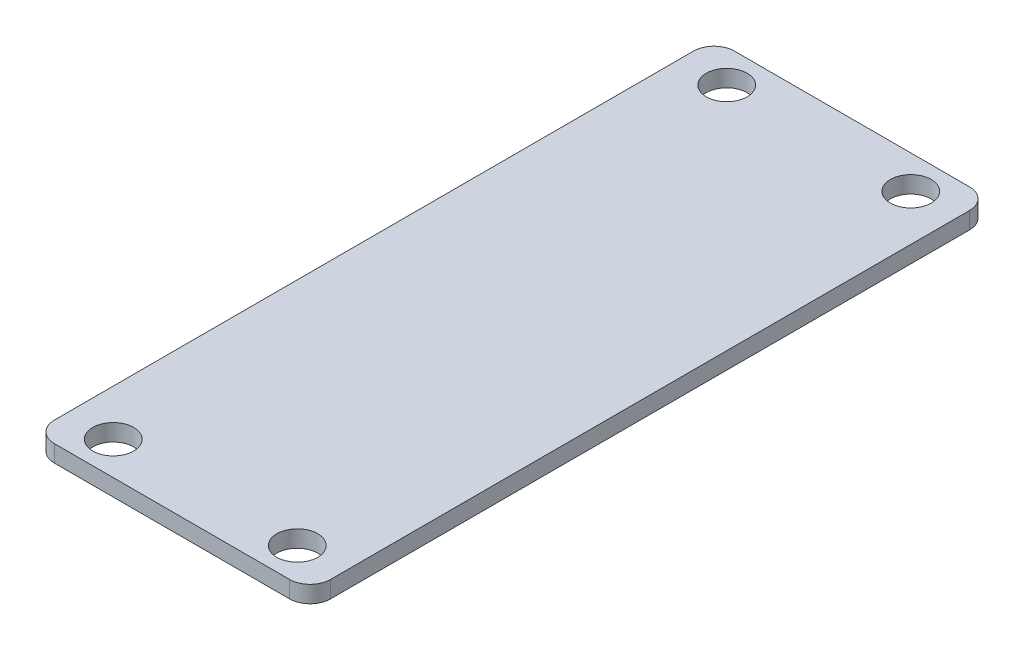
ISO-10303-21;
HEADER;
FILE_DESCRIPTION(('STEP AP214'),'2;1');
FILE_NAME('part.step','',(''),(''),'','','');
FILE_SCHEMA(('AUTOMOTIVE_DESIGN { 1 0 10303 214 1 1 1 1 }'));
ENDSEC;
DATA;
#1=APPLICATION_CONTEXT('core data for automotive mechanical design processes');
#2=APPLICATION_PROTOCOL_DEFINITION('international standard','automotive_design',2000,#1);
#3=PRODUCT_CONTEXT('',#1,'mechanical');
#4=PRODUCT('Part','Part','',(#3));
#5=PRODUCT_RELATED_PRODUCT_CATEGORY('part','',(#4));
#6=PRODUCT_DEFINITION_FORMATION('','',#4);
#7=PRODUCT_DEFINITION_CONTEXT('part definition',#1,'design');
#8=PRODUCT_DEFINITION('design','',#6,#7);
#9=PRODUCT_DEFINITION_SHAPE('','',#8);
#10=(LENGTH_UNIT() NAMED_UNIT(*) SI_UNIT(.MILLI.,.METRE.));
#11=(NAMED_UNIT(*) PLANE_ANGLE_UNIT() SI_UNIT($,.RADIAN.));
#12=(NAMED_UNIT(*) SI_UNIT($,.STERADIAN.) SOLID_ANGLE_UNIT());
#13=UNCERTAINTY_MEASURE_WITH_UNIT(LENGTH_MEASURE(1.E-05),#10,'distance_accuracy_value','');
#14=(GEOMETRIC_REPRESENTATION_CONTEXT(3) GLOBAL_UNCERTAINTY_ASSIGNED_CONTEXT((#13)) GLOBAL_UNIT_ASSIGNED_CONTEXT((#10,
#11,#12)) REPRESENTATION_CONTEXT('',''));
#15=CARTESIAN_POINT('',(0.,0.,0.));
#16=DIRECTION('',(0.,0.,1.));
#17=DIRECTION('',(1.,0.,0.));
#18=AXIS2_PLACEMENT_3D('',#15,#16,#17);
#19=CARTESIAN_POINT('',(-13.5,1.65,33.25));
#20=DIRECTION('',(1.,0.,0.));
#21=DIRECTION('',(0.,0.,-1.));
#22=AXIS2_PLACEMENT_3D('',#19,#20,#21);
#23=PLANE('',#22);
#24=DIRECTION('',(0.,0.,1.));
#25=VECTOR('',#24,1.);
#26=CARTESIAN_POINT('',(-13.5,1.65,33.25));
#27=LINE('',#26,#25);
#28=CARTESIAN_POINT('',(-13.5,1.65,-31.25));
#29=VERTEX_POINT('',#28);
#30=CARTESIAN_POINT('',(-13.5,1.65,31.25));
#31=VERTEX_POINT('',#30);
#32=EDGE_CURVE('E125',#29,#31,#27,.T.);
#33=ORIENTED_EDGE('',*,*,#32,.F.);
#34=DIRECTION('',(0.,-1.,0.));
#35=VECTOR('',#34,1.);
#36=CARTESIAN_POINT('',(-13.5,1.65,-31.25));
#37=LINE('',#36,#35);
#38=CARTESIAN_POINT('',(-13.5,0.,-31.25));
#39=VERTEX_POINT('',#38);
#40=EDGE_CURVE('E151',#29,#39,#37,.T.);
#41=ORIENTED_EDGE('',*,*,#40,.T.);
#42=DIRECTION('',(0.,0.,1.));
#43=VECTOR('',#42,1.);
#44=CARTESIAN_POINT('',(-13.5,0.,33.25));
#45=LINE('',#44,#43);
#46=CARTESIAN_POINT('',(-13.5,0.,31.25));
#47=VERTEX_POINT('',#46);
#48=EDGE_CURVE('E157',#39,#47,#45,.T.);
#49=ORIENTED_EDGE('',*,*,#48,.T.);
#50=DIRECTION('',(0.,-1.,0.));
#51=VECTOR('',#50,1.);
#52=CARTESIAN_POINT('',(-13.5,1.65,31.25));
#53=LINE('',#52,#51);
#54=EDGE_CURVE('E149',#47,#31,#53,.F.);
#55=ORIENTED_EDGE('',*,*,#54,.T.);
#56=EDGE_LOOP('',(#33,#41,#49,#55));
#57=FACE_BOUND('',#56,.T.);
#58=ADVANCED_FACE('F33',(#57),#23,.F.);
#59=CARTESIAN_POINT('',(13.5,1.65,33.25));
#60=DIRECTION('',(0.,0.,-1.));
#61=DIRECTION('',(-1.,0.,0.));
#62=AXIS2_PLACEMENT_3D('',#59,#60,#61);
#63=PLANE('',#62);
#64=DIRECTION('',(1.,0.,0.));
#65=VECTOR('',#64,1.);
#66=CARTESIAN_POINT('',(13.5,1.65,33.25));
#67=LINE('',#66,#65);
#68=CARTESIAN_POINT('',(-11.5,1.65,33.25));
#69=VERTEX_POINT('',#68);
#70=CARTESIAN_POINT('',(11.5,1.65,33.25));
#71=VERTEX_POINT('',#70);
#72=EDGE_CURVE('E128',#69,#71,#67,.T.);
#73=ORIENTED_EDGE('',*,*,#72,.F.);
#74=DIRECTION('',(0.,-1.,0.));
#75=VECTOR('',#74,1.);
#76=CARTESIAN_POINT('',(-11.5,1.65,33.25));
#77=LINE('',#76,#75);
#78=CARTESIAN_POINT('',(-11.5,0.,33.25));
#79=VERTEX_POINT('',#78);
#80=EDGE_CURVE('E11',#69,#79,#77,.T.);
#81=ORIENTED_EDGE('',*,*,#80,.T.);
#82=DIRECTION('',(1.,0.,0.));
#83=VECTOR('',#82,1.);
#84=CARTESIAN_POINT('',(13.5,0.,33.25));
#85=LINE('',#84,#83);
#86=CARTESIAN_POINT('',(11.5,0.,33.25));
#87=VERTEX_POINT('',#86);
#88=EDGE_CURVE('E130',#79,#87,#85,.T.);
#89=ORIENTED_EDGE('',*,*,#88,.T.);
#90=DIRECTION('',(0.,-1.,0.));
#91=VECTOR('',#90,1.);
#92=CARTESIAN_POINT('',(11.5,1.65,33.25));
#93=LINE('',#92,#91);
#94=EDGE_CURVE('E41',#87,#71,#93,.F.);
#95=ORIENTED_EDGE('',*,*,#94,.T.);
#96=EDGE_LOOP('',(#73,#81,#89,#95));
#97=FACE_BOUND('',#96,.T.);
#98=ADVANCED_FACE('F216',(#97),#63,.F.);
#99=CARTESIAN_POINT('',(13.5,1.65,33.25));
#100=DIRECTION('',(-1.,0.,0.));
#101=DIRECTION('',(0.,0.,1.));
#102=AXIS2_PLACEMENT_3D('',#99,#100,#101);
#103=PLANE('',#102);
#104=DIRECTION('',(0.,0.,-1.));
#105=VECTOR('',#104,1.);
#106=CARTESIAN_POINT('',(13.5,0.,33.25));
#107=LINE('',#106,#105);
#108=CARTESIAN_POINT('',(13.5,0.,31.25));
#109=VERTEX_POINT('',#108);
#110=CARTESIAN_POINT('',(13.5,0.,-31.25));
#111=VERTEX_POINT('',#110);
#112=EDGE_CURVE('E126',#109,#111,#107,.T.);
#113=ORIENTED_EDGE('',*,*,#112,.T.);
#114=DIRECTION('',(0.,-1.,0.));
#115=VECTOR('',#114,1.);
#116=CARTESIAN_POINT('',(13.5,1.65,-31.25));
#117=LINE('',#116,#115);
#118=CARTESIAN_POINT('',(13.5,1.65,-31.25));
#119=VERTEX_POINT('',#118);
#120=EDGE_CURVE('E104',#111,#119,#117,.F.);
#121=ORIENTED_EDGE('',*,*,#120,.T.);
#122=DIRECTION('',(0.,0.,-1.));
#123=VECTOR('',#122,1.);
#124=CARTESIAN_POINT('',(13.5,1.65,33.25));
#125=LINE('',#124,#123);
#126=CARTESIAN_POINT('',(13.5,1.65,31.25));
#127=VERTEX_POINT('',#126);
#128=EDGE_CURVE('E169',#127,#119,#125,.T.);
#129=ORIENTED_EDGE('',*,*,#128,.F.);
#130=DIRECTION('',(0.,-1.,0.));
#131=VECTOR('',#130,1.);
#132=CARTESIAN_POINT('',(13.5,1.65,31.25));
#133=LINE('',#132,#131);
#134=EDGE_CURVE('E109',#127,#109,#133,.T.);
#135=ORIENTED_EDGE('',*,*,#134,.T.);
#136=EDGE_LOOP('',(#113,#121,#129,#135));
#137=FACE_BOUND('',#136,.T.);
#138=ADVANCED_FACE('F214',(#137),#103,.F.);
#139=CARTESIAN_POINT('',(13.5,1.65,-33.25));
#140=DIRECTION('',(0.,0.,1.));
#141=DIRECTION('',(1.,0.,0.));
#142=AXIS2_PLACEMENT_3D('',#139,#140,#141);
#143=PLANE('',#142);
#144=DIRECTION('',(-1.,0.,0.));
#145=VECTOR('',#144,1.);
#146=CARTESIAN_POINT('',(13.5,1.65,-33.25));
#147=LINE('',#146,#145);
#148=CARTESIAN_POINT('',(11.5,1.65,-33.25));
#149=VERTEX_POINT('',#148);
#150=CARTESIAN_POINT('',(-11.5,1.65,-33.25));
#151=VERTEX_POINT('',#150);
#152=EDGE_CURVE('E119',#149,#151,#147,.T.);
#153=ORIENTED_EDGE('',*,*,#152,.F.);
#154=DIRECTION('',(0.,-1.,0.));
#155=VECTOR('',#154,1.);
#156=CARTESIAN_POINT('',(11.5,1.65,-33.25));
#157=LINE('',#156,#155);
#158=CARTESIAN_POINT('',(11.5,0.,-33.25));
#159=VERTEX_POINT('',#158);
#160=EDGE_CURVE('E103',#149,#159,#157,.T.);
#161=ORIENTED_EDGE('',*,*,#160,.T.);
#162=DIRECTION('',(-1.,0.,0.));
#163=VECTOR('',#162,1.);
#164=CARTESIAN_POINT('',(13.5,0.,-33.25));
#165=LINE('',#164,#163);
#166=CARTESIAN_POINT('',(-11.5,0.,-33.25));
#167=VERTEX_POINT('',#166);
#168=EDGE_CURVE('E116',#159,#167,#165,.T.);
#169=ORIENTED_EDGE('',*,*,#168,.T.);
#170=DIRECTION('',(0.,-1.,0.));
#171=VECTOR('',#170,1.);
#172=CARTESIAN_POINT('',(-11.5,1.65,-33.25));
#173=LINE('',#172,#171);
#174=EDGE_CURVE('E121',#167,#151,#173,.F.);
#175=ORIENTED_EDGE('',*,*,#174,.T.);
#176=EDGE_LOOP('',(#153,#161,#169,#175));
#177=FACE_BOUND('',#176,.T.);
#178=ADVANCED_FACE('F115',(#177),#143,.F.);
#179=CARTESIAN_POINT('',(0.,1.65,0.));
#180=DIRECTION('',(0.,1.,0.));
#181=DIRECTION('',(0.,0.,1.));
#182=AXIS2_PLACEMENT_3D('',#179,#180,#181);
#183=PLANE('',#182);
#184=CARTESIAN_POINT('',(-9.,1.65,30.));
#185=DIRECTION('',(0.,1.,0.));
#186=DIRECTION('',(0.,0.,1.));
#187=AXIS2_PLACEMENT_3D('',#184,#185,#186);
#188=CIRCLE('',#187,2.);
#189=CARTESIAN_POINT('',(-9.,1.65,32.));
#190=VERTEX_POINT('',#189);
#191=EDGE_CURVE('E176',#190,#190,#188,.T.);
#192=ORIENTED_EDGE('',*,*,#191,.F.);
#193=EDGE_LOOP('',(#192));
#194=FACE_BOUND('',#193,.T.);
#195=CARTESIAN_POINT('',(9.,1.65,30.));
#196=DIRECTION('',(0.,1.,0.));
#197=DIRECTION('',(0.,0.,1.));
#198=AXIS2_PLACEMENT_3D('',#195,#196,#197);
#199=CIRCLE('',#198,2.);
#200=CARTESIAN_POINT('',(9.,1.65,32.));
#201=VERTEX_POINT('',#200);
#202=EDGE_CURVE('E182',#201,#201,#199,.T.);
#203=ORIENTED_EDGE('',*,*,#202,.F.);
#204=EDGE_LOOP('',(#203));
#205=FACE_BOUND('',#204,.T.);
#206=CARTESIAN_POINT('',(9.,1.65,-30.));
#207=DIRECTION('',(0.,1.,0.));
#208=DIRECTION('',(0.,0.,1.));
#209=AXIS2_PLACEMENT_3D('',#206,#207,#208);
#210=CIRCLE('',#209,2.);
#211=CARTESIAN_POINT('',(9.,1.65,-28.));
#212=VERTEX_POINT('',#211);
#213=EDGE_CURVE('E188',#212,#212,#210,.T.);
#214=ORIENTED_EDGE('',*,*,#213,.F.);
#215=EDGE_LOOP('',(#214));
#216=FACE_BOUND('',#215,.T.);
#217=CARTESIAN_POINT('',(-9.,1.65,-30.));
#218=DIRECTION('',(0.,1.,0.));
#219=DIRECTION('',(0.,0.,1.));
#220=AXIS2_PLACEMENT_3D('',#217,#218,#219);
#221=CIRCLE('',#220,2.);
#222=CARTESIAN_POINT('',(-9.,1.65,-28.));
#223=VERTEX_POINT('',#222);
#224=EDGE_CURVE('E165',#223,#223,#221,.T.);
#225=ORIENTED_EDGE('',*,*,#224,.F.);
#226=EDGE_LOOP('',(#225));
#227=FACE_BOUND('',#226,.T.);
#228=ORIENTED_EDGE('',*,*,#128,.T.);
#229=CARTESIAN_POINT('',(11.5,1.65,-31.25));
#230=DIRECTION('',(0.,1.,0.));
#231=DIRECTION('',(0.,0.,1.));
#232=AXIS2_PLACEMENT_3D('',#229,#230,#231);
#233=CIRCLE('',#232,2.);
#234=EDGE_CURVE('E147',#119,#149,#233,.T.);
#235=ORIENTED_EDGE('',*,*,#234,.T.);
#236=ORIENTED_EDGE('',*,*,#152,.T.);
#237=CARTESIAN_POINT('',(-11.5,1.65,-31.25));
#238=DIRECTION('',(0.,1.,0.));
#239=DIRECTION('',(0.,0.,1.));
#240=AXIS2_PLACEMENT_3D('',#237,#238,#239);
#241=CIRCLE('',#240,2.);
#242=EDGE_CURVE('E145',#151,#29,#241,.T.);
#243=ORIENTED_EDGE('',*,*,#242,.T.);
#244=ORIENTED_EDGE('',*,*,#32,.T.);
#245=CARTESIAN_POINT('',(-11.5,1.65,31.25));
#246=DIRECTION('',(0.,1.,0.));
#247=DIRECTION('',(0.,0.,1.));
#248=AXIS2_PLACEMENT_3D('',#245,#246,#247);
#249=CIRCLE('',#248,2.);
#250=EDGE_CURVE('E54',#31,#69,#249,.T.);
#251=ORIENTED_EDGE('',*,*,#250,.T.);
#252=ORIENTED_EDGE('',*,*,#72,.T.);
#253=CARTESIAN_POINT('',(11.5,1.65,31.25));
#254=DIRECTION('',(0.,1.,0.));
#255=DIRECTION('',(0.,0.,1.));
#256=AXIS2_PLACEMENT_3D('',#253,#254,#255);
#257=CIRCLE('',#256,2.);
#258=EDGE_CURVE('E142',#71,#127,#257,.T.);
#259=ORIENTED_EDGE('',*,*,#258,.T.);
#260=EDGE_LOOP('',(#228,#235,#236,#243,#244,#251,#252,#259));
#261=FACE_BOUND('',#260,.T.);
#262=ADVANCED_FACE('F204',(#194,#205,#216,#227,#261),#183,.T.);
#263=CARTESIAN_POINT('',(0.,0.,0.));
#264=DIRECTION('',(0.,1.,0.));
#265=DIRECTION('',(0.,0.,1.));
#266=AXIS2_PLACEMENT_3D('',#263,#264,#265);
#267=PLANE('',#266);
#268=CARTESIAN_POINT('',(-9.,0.,30.));
#269=DIRECTION('',(0.,1.,0.));
#270=DIRECTION('',(0.,0.,1.));
#271=AXIS2_PLACEMENT_3D('',#268,#269,#270);
#272=CIRCLE('',#271,2.);
#273=CARTESIAN_POINT('',(-9.,0.,32.));
#274=VERTEX_POINT('',#273);
#275=EDGE_CURVE('E179',#274,#274,#272,.T.);
#276=ORIENTED_EDGE('',*,*,#275,.T.);
#277=EDGE_LOOP('',(#276));
#278=FACE_BOUND('',#277,.T.);
#279=CARTESIAN_POINT('',(9.,0.,30.));
#280=DIRECTION('',(0.,1.,0.));
#281=DIRECTION('',(0.,0.,1.));
#282=AXIS2_PLACEMENT_3D('',#279,#280,#281);
#283=CIRCLE('',#282,2.);
#284=CARTESIAN_POINT('',(9.,0.,32.));
#285=VERTEX_POINT('',#284);
#286=EDGE_CURVE('E185',#285,#285,#283,.T.);
#287=ORIENTED_EDGE('',*,*,#286,.T.);
#288=EDGE_LOOP('',(#287));
#289=FACE_BOUND('',#288,.T.);
#290=CARTESIAN_POINT('',(9.,0.,-30.));
#291=DIRECTION('',(0.,1.,0.));
#292=DIRECTION('',(0.,0.,1.));
#293=AXIS2_PLACEMENT_3D('',#290,#291,#292);
#294=CIRCLE('',#293,2.);
#295=CARTESIAN_POINT('',(9.,0.,-28.));
#296=VERTEX_POINT('',#295);
#297=EDGE_CURVE('E174',#296,#296,#294,.T.);
#298=ORIENTED_EDGE('',*,*,#297,.T.);
#299=EDGE_LOOP('',(#298));
#300=FACE_BOUND('',#299,.T.);
#301=CARTESIAN_POINT('',(-9.,0.,-30.));
#302=DIRECTION('',(0.,1.,0.));
#303=DIRECTION('',(0.,0.,1.));
#304=AXIS2_PLACEMENT_3D('',#301,#302,#303);
#305=CIRCLE('',#304,2.);
#306=CARTESIAN_POINT('',(-9.,0.,-28.));
#307=VERTEX_POINT('',#306);
#308=EDGE_CURVE('E162',#307,#307,#305,.T.);
#309=ORIENTED_EDGE('',*,*,#308,.T.);
#310=EDGE_LOOP('',(#309));
#311=FACE_BOUND('',#310,.T.);
#312=ORIENTED_EDGE('',*,*,#168,.F.);
#313=CARTESIAN_POINT('',(11.5,0.,-31.25));
#314=DIRECTION('',(0.,1.,0.));
#315=DIRECTION('',(0.,0.,1.));
#316=AXIS2_PLACEMENT_3D('',#313,#314,#315);
#317=CIRCLE('',#316,2.);
#318=EDGE_CURVE('E99',#159,#111,#317,.F.);
#319=ORIENTED_EDGE('',*,*,#318,.T.);
#320=ORIENTED_EDGE('',*,*,#112,.F.);
#321=CARTESIAN_POINT('',(11.5,0.,31.25));
#322=DIRECTION('',(0.,1.,0.));
#323=DIRECTION('',(0.,0.,1.));
#324=AXIS2_PLACEMENT_3D('',#321,#322,#323);
#325=CIRCLE('',#324,2.);
#326=EDGE_CURVE('E120',#109,#87,#325,.F.);
#327=ORIENTED_EDGE('',*,*,#326,.T.);
#328=ORIENTED_EDGE('',*,*,#88,.F.);
#329=CARTESIAN_POINT('',(-11.5,0.,31.25));
#330=DIRECTION('',(0.,1.,0.));
#331=DIRECTION('',(0.,0.,1.));
#332=AXIS2_PLACEMENT_3D('',#329,#330,#331);
#333=CIRCLE('',#332,2.);
#334=EDGE_CURVE('E136',#79,#47,#333,.F.);
#335=ORIENTED_EDGE('',*,*,#334,.T.);
#336=ORIENTED_EDGE('',*,*,#48,.F.);
#337=CARTESIAN_POINT('',(-11.5,0.,-31.25));
#338=DIRECTION('',(0.,1.,0.));
#339=DIRECTION('',(0.,0.,1.));
#340=AXIS2_PLACEMENT_3D('',#337,#338,#339);
#341=CIRCLE('',#340,2.);
#342=EDGE_CURVE('E110',#39,#167,#341,.F.);
#343=ORIENTED_EDGE('',*,*,#342,.T.);
#344=EDGE_LOOP('',(#312,#319,#320,#327,#328,#335,#336,#343));
#345=FACE_BOUND('',#344,.T.);
#346=ADVANCED_FACE('F123',(#278,#289,#300,#311,#345),#267,.F.);
#347=CARTESIAN_POINT('',(11.5,1.65,-31.25));
#348=DIRECTION('',(0.,-1.,0.));
#349=DIRECTION('',(0.,0.,-1.));
#350=AXIS2_PLACEMENT_3D('',#347,#348,#349);
#351=CYLINDRICAL_SURFACE('',#350,2.);
#352=ORIENTED_EDGE('',*,*,#234,.F.);
#353=ORIENTED_EDGE('',*,*,#120,.F.);
#354=ORIENTED_EDGE('',*,*,#318,.F.);
#355=ORIENTED_EDGE('',*,*,#160,.F.);
#356=EDGE_LOOP('',(#352,#353,#354,#355));
#357=FACE_BOUND('',#356,.T.);
#358=ADVANCED_FACE('F102',(#357),#351,.T.);
#359=CARTESIAN_POINT('',(-11.5,1.65,-31.25));
#360=DIRECTION('',(0.,-1.,0.));
#361=DIRECTION('',(0.,0.,-1.));
#362=AXIS2_PLACEMENT_3D('',#359,#360,#361);
#363=CYLINDRICAL_SURFACE('',#362,2.);
#364=ORIENTED_EDGE('',*,*,#242,.F.);
#365=ORIENTED_EDGE('',*,*,#174,.F.);
#366=ORIENTED_EDGE('',*,*,#342,.F.);
#367=ORIENTED_EDGE('',*,*,#40,.F.);
#368=EDGE_LOOP('',(#364,#365,#366,#367));
#369=FACE_BOUND('',#368,.T.);
#370=ADVANCED_FACE('F220',(#369),#363,.T.);
#371=CARTESIAN_POINT('',(-11.5,1.65,31.25));
#372=DIRECTION('',(0.,-1.,0.));
#373=DIRECTION('',(0.,0.,-1.));
#374=AXIS2_PLACEMENT_3D('',#371,#372,#373);
#375=CYLINDRICAL_SURFACE('',#374,2.);
#376=ORIENTED_EDGE('',*,*,#250,.F.);
#377=ORIENTED_EDGE('',*,*,#54,.F.);
#378=ORIENTED_EDGE('',*,*,#334,.F.);
#379=ORIENTED_EDGE('',*,*,#80,.F.);
#380=EDGE_LOOP('',(#376,#377,#378,#379));
#381=FACE_BOUND('',#380,.T.);
#382=ADVANCED_FACE('F219',(#381),#375,.T.);
#383=CARTESIAN_POINT('',(11.5,1.65,31.25));
#384=DIRECTION('',(0.,-1.,0.));
#385=DIRECTION('',(0.,0.,-1.));
#386=AXIS2_PLACEMENT_3D('',#383,#384,#385);
#387=CYLINDRICAL_SURFACE('',#386,2.);
#388=ORIENTED_EDGE('',*,*,#258,.F.);
#389=ORIENTED_EDGE('',*,*,#94,.F.);
#390=ORIENTED_EDGE('',*,*,#326,.F.);
#391=ORIENTED_EDGE('',*,*,#134,.F.);
#392=EDGE_LOOP('',(#388,#389,#390,#391));
#393=FACE_BOUND('',#392,.T.);
#394=ADVANCED_FACE('F35',(#393),#387,.T.);
#395=CARTESIAN_POINT('',(-9.,0.,-30.));
#396=DIRECTION('',(0.,1.,0.));
#397=DIRECTION('',(0.,0.,1.));
#398=AXIS2_PLACEMENT_3D('',#395,#396,#397);
#399=CYLINDRICAL_SURFACE('',#398,2.);
#400=ORIENTED_EDGE('',*,*,#308,.F.);
#401=EDGE_LOOP('',(#400));
#402=FACE_BOUND('',#401,.T.);
#403=ORIENTED_EDGE('',*,*,#224,.T.);
#404=EDGE_LOOP('',(#403));
#405=FACE_BOUND('',#404,.T.);
#406=ADVANCED_FACE('F200',(#402,#405),#399,.F.);
#407=CARTESIAN_POINT('',(9.,0.,-30.));
#408=DIRECTION('',(0.,1.,0.));
#409=DIRECTION('',(0.,0.,1.));
#410=AXIS2_PLACEMENT_3D('',#407,#408,#409);
#411=CYLINDRICAL_SURFACE('',#410,2.);
#412=ORIENTED_EDGE('',*,*,#297,.F.);
#413=EDGE_LOOP('',(#412));
#414=FACE_BOUND('',#413,.T.);
#415=ORIENTED_EDGE('',*,*,#213,.T.);
#416=EDGE_LOOP('',(#415));
#417=FACE_BOUND('',#416,.T.);
#418=ADVANCED_FACE('F196',(#414,#417),#411,.F.);
#419=CARTESIAN_POINT('',(9.,0.,30.));
#420=DIRECTION('',(0.,1.,0.));
#421=DIRECTION('',(0.,0.,1.));
#422=AXIS2_PLACEMENT_3D('',#419,#420,#421);
#423=CYLINDRICAL_SURFACE('',#422,2.);
#424=ORIENTED_EDGE('',*,*,#286,.F.);
#425=EDGE_LOOP('',(#424));
#426=FACE_BOUND('',#425,.T.);
#427=ORIENTED_EDGE('',*,*,#202,.T.);
#428=EDGE_LOOP('',(#427));
#429=FACE_BOUND('',#428,.T.);
#430=ADVANCED_FACE('F199',(#426,#429),#423,.F.);
#431=CARTESIAN_POINT('',(-9.,0.,30.));
#432=DIRECTION('',(0.,1.,0.));
#433=DIRECTION('',(0.,0.,1.));
#434=AXIS2_PLACEMENT_3D('',#431,#432,#433);
#435=CYLINDRICAL_SURFACE('',#434,2.);
#436=ORIENTED_EDGE('',*,*,#275,.F.);
#437=EDGE_LOOP('',(#436));
#438=FACE_BOUND('',#437,.T.);
#439=ORIENTED_EDGE('',*,*,#191,.T.);
#440=EDGE_LOOP('',(#439));
#441=FACE_BOUND('',#440,.T.);
#442=ADVANCED_FACE('F245',(#438,#441),#435,.F.);
#443=CLOSED_SHELL('',(#58,#98,#138,#178,#262,#346,#358,#370,#382,#394,#406,#418,#430,#442));
#444=MANIFOLD_SOLID_BREP('B2',#443);
#445=ADVANCED_BREP_SHAPE_REPRESENTATION('',(#18,#444),#14);
#446=SHAPE_DEFINITION_REPRESENTATION(#9,#445);
ENDSEC;
END-ISO-10303-21;
